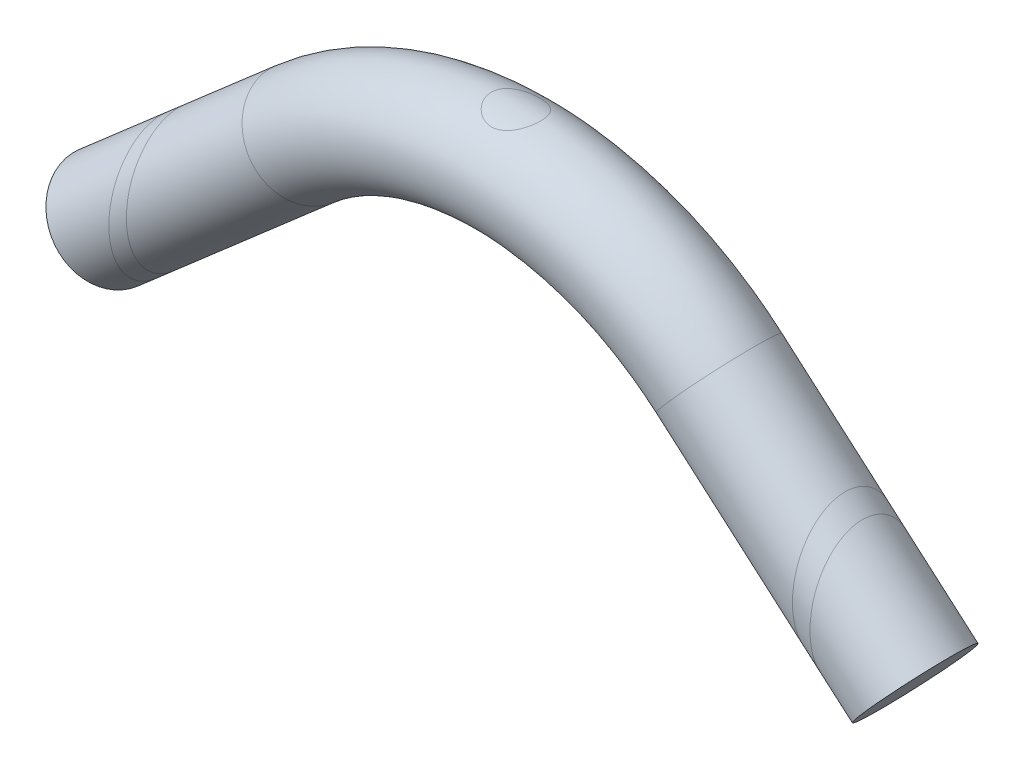
ISO-10303-21;
HEADER;
FILE_DESCRIPTION(('STEP AP214'),'2;1');
FILE_NAME('part.step','',(''),(''),'','','');
FILE_SCHEMA(('AUTOMOTIVE_DESIGN { 1 0 10303 214 1 1 1 1 }'));
ENDSEC;
DATA;
#1=APPLICATION_CONTEXT('core data for automotive mechanical design processes');
#2=APPLICATION_PROTOCOL_DEFINITION('international standard','automotive_design',2000,#1);
#3=PRODUCT_CONTEXT('',#1,'mechanical');
#4=PRODUCT('Part','Part','',(#3));
#5=PRODUCT_RELATED_PRODUCT_CATEGORY('part','',(#4));
#6=PRODUCT_DEFINITION_FORMATION('','',#4);
#7=PRODUCT_DEFINITION_CONTEXT('part definition',#1,'design');
#8=PRODUCT_DEFINITION('design','',#6,#7);
#9=PRODUCT_DEFINITION_SHAPE('','',#8);
#10=(LENGTH_UNIT() NAMED_UNIT(*) SI_UNIT(.MILLI.,.METRE.));
#11=(NAMED_UNIT(*) PLANE_ANGLE_UNIT() SI_UNIT($,.RADIAN.));
#12=(NAMED_UNIT(*) SI_UNIT($,.STERADIAN.) SOLID_ANGLE_UNIT());
#13=UNCERTAINTY_MEASURE_WITH_UNIT(LENGTH_MEASURE(1.E-05),#10,'distance_accuracy_value','');
#14=(GEOMETRIC_REPRESENTATION_CONTEXT(3) GLOBAL_UNCERTAINTY_ASSIGNED_CONTEXT((#13)) GLOBAL_UNIT_ASSIGNED_CONTEXT((#10,
#11,#12)) REPRESENTATION_CONTEXT('',''));
#15=CARTESIAN_POINT('',(0.,0.,0.));
#16=DIRECTION('',(0.,0.,1.));
#17=DIRECTION('',(1.,0.,0.));
#18=AXIS2_PLACEMENT_3D('',#15,#16,#17);
#19=CARTESIAN_POINT('',(55.9439156567688,48.6468831797989,0.));
#20=DIRECTION('',(-0.754605522163505,-0.656178714924787,0.));
#21=DIRECTION('',(0.656178714924787,-0.754605522163505,0.));
#22=AXIS2_PLACEMENT_3D('',#19,#20,#21);
#23=CYLINDRICAL_SURFACE('',#22,15.);
#24=CARTESIAN_POINT('',(55.9439156567688,48.6468831797989,0.));
#25=DIRECTION('',(0.7546055221635,0.656178714924792,0.));
#26=DIRECTION('',(0.,0.,-1.));
#27=AXIS2_PLACEMENT_3D('',#24,#25,#26);
#28=CIRCLE('',#27,15.);
#29=CARTESIAN_POINT('',(55.9439156567688,48.6468831797989,-15.));
#30=VERTEX_POINT('',#29);
#31=EDGE_CURVE('E122',#30,#30,#28,.T.);
#32=ORIENTED_EDGE('',*,*,#31,.F.);
#33=EDGE_LOOP('',(#32));
#34=FACE_BOUND('',#33,.T.);
#35=CARTESIAN_POINT('',(20.,17.3913043478261,0.));
#36=DIRECTION('',(1.,0.,0.));
#37=DIRECTION('',(0.,-1.,0.));
#38=AXIS2_PLACEMENT_3D('',#35,#36,#37);
#39=ELLIPSE('',#38,19.8779356358194,15.);
#40=CARTESIAN_POINT('',(20.,-2.48663128799326,0.));
#41=VERTEX_POINT('',#40);
#42=EDGE_CURVE('E11',#41,#41,#39,.T.);
#43=ORIENTED_EDGE('',*,*,#42,.T.);
#44=EDGE_LOOP('',(#43));
#45=FACE_BOUND('',#44,.T.);
#46=ADVANCED_FACE('F40',(#34,#45),#23,.T.);
#47=CARTESIAN_POINT('',(174.056084343231,48.6468831797989,0.));
#48=DIRECTION('',(0.754605522163505,-0.656178714924787,0.));
#49=DIRECTION('',(0.656178714924787,0.754605522163505,0.));
#50=AXIS2_PLACEMENT_3D('',#47,#48,#49);
#51=CYLINDRICAL_SURFACE('',#50,15.);
#52=CARTESIAN_POINT('',(174.056084343231,48.6468831797989,0.));
#53=DIRECTION('',(0.754605522163501,-0.656178714924791,0.));
#54=DIRECTION('',(0.,0.,-1.));
#55=AXIS2_PLACEMENT_3D('',#52,#53,#54);
#56=CIRCLE('',#55,15.);
#57=CARTESIAN_POINT('',(174.056084343231,48.6468831797989,-15.));
#58=VERTEX_POINT('',#57);
#59=EDGE_CURVE('E128',#58,#58,#56,.T.);
#60=ORIENTED_EDGE('',*,*,#59,.T.);
#61=EDGE_LOOP('',(#60));
#62=FACE_BOUND('',#61,.T.);
#63=CARTESIAN_POINT('',(210.,17.3913043478261,0.));
#64=DIRECTION('',(-1.,0.,0.));
#65=DIRECTION('',(0.,-1.,0.));
#66=AXIS2_PLACEMENT_3D('',#63,#64,#65);
#67=ELLIPSE('',#66,19.8779356358194,15.);
#68=CARTESIAN_POINT('',(210.,-2.48663128799325,0.));
#69=VERTEX_POINT('',#68);
#70=EDGE_CURVE('E47',#69,#69,#67,.T.);
#71=ORIENTED_EDGE('',*,*,#70,.T.);
#72=EDGE_LOOP('',(#71));
#73=FACE_BOUND('',#72,.T.);
#74=ADVANCED_FACE('F95',(#62,#73),#51,.T.);
#75=ORIENTED_EDGE('',*,*,#70,.F.);
#76=EDGE_LOOP('',(#75));
#77=FACE_BOUND('',#76,.T.);
#78=CARTESIAN_POINT('',(215.,13.0434782608696,0.));
#79=DIRECTION('',(-1.,0.,0.));
#80=DIRECTION('',(0.,-1.,0.));
#81=AXIS2_PLACEMENT_3D('',#78,#79,#80);
#82=ELLIPSE('',#81,19.8779356358194,15.);
#83=CARTESIAN_POINT('',(215.,-6.83445737494978,0.));
#84=VERTEX_POINT('',#83);
#85=EDGE_CURVE('E51',#84,#84,#82,.T.);
#86=ORIENTED_EDGE('',*,*,#85,.T.);
#87=EDGE_LOOP('',(#86));
#88=FACE_BOUND('',#87,.T.);
#89=ADVANCED_FACE('F96',(#77,#88),#51,.T.);
#90=ORIENTED_EDGE('',*,*,#42,.F.);
#91=EDGE_LOOP('',(#90));
#92=FACE_BOUND('',#91,.T.);
#93=CARTESIAN_POINT('',(15.,13.0434782608696,0.));
#94=DIRECTION('',(1.,0.,0.));
#95=DIRECTION('',(0.,-1.,0.));
#96=AXIS2_PLACEMENT_3D('',#93,#94,#95);
#97=ELLIPSE('',#96,19.8779356358194,15.);
#98=CARTESIAN_POINT('',(15.,-6.83445737494979,0.));
#99=VERTEX_POINT('',#98);
#100=EDGE_CURVE('E55',#99,#99,#97,.T.);
#101=ORIENTED_EDGE('',*,*,#100,.T.);
#102=EDGE_LOOP('',(#101));
#103=FACE_BOUND('',#102,.T.);
#104=ADVANCED_FACE('F86',(#92,#103),#23,.T.);
#105=CARTESIAN_POINT('',(115.,-19.2676138149161,0.));
#106=DIRECTION('',(0.,0.,-1.));
#107=DIRECTION('',(-1.,0.,0.));
#108=AXIS2_PLACEMENT_3D('',#105,#106,#107);
#109=TOROIDAL_SURFACE('',#108,90.,15.);
#110=CARTESIAN_POINT('',(110.588080153037,85.0106860922542,-4.2962066277505));
#111=CARTESIAN_POINT('',(110.710333370802,84.9688042737843,-4.4534690690307));
#112=CARTESIAN_POINT('',(110.839197371035,84.9257780592193,-4.60537547301822));
#113=CARTESIAN_POINT('',(111.1092662584,84.8385685155191,-4.89755901823602));
#114=CARTESIAN_POINT('',(111.250478951075,84.7943844670604,-5.03782869320342));
#115=CARTESIAN_POINT('',(111.544722648569,84.7059378756666,-5.30620513999618));
#116=CARTESIAN_POINT('',(111.697783390272,84.6616754268374,-5.43427938207064));
#117=CARTESIAN_POINT('',(112.014505516151,84.5744150263256,-5.67705037735854));
#118=CARTESIAN_POINT('',(112.1781667711,84.5314170592374,-5.7917472936023));
#119=CARTESIAN_POINT('',(112.515366098727,84.4478828490656,-6.00711752303018));
#120=CARTESIAN_POINT('',(112.688915873195,84.4073496450391,-6.10777371412001));
#121=CARTESIAN_POINT('',(113.044595434889,84.3300760783223,-6.29406440857466));
#122=CARTESIAN_POINT('',(113.226720619008,84.2933337138385,-6.37970685698598));
#123=CARTESIAN_POINT('',(113.598324847087,84.2248607838035,-6.53519724918478));
#124=CARTESIAN_POINT('',(113.787797448337,84.1931259458068,-6.60505867961943));
#125=CARTESIAN_POINT('',(114.172914955624,84.1357511855118,-6.72834766548335));
#126=CARTESIAN_POINT('',(114.36855940978,84.1101108181647,-6.78177642099294));
#127=CARTESIAN_POINT('',(114.755652334536,84.0668680557006,-6.8695575852939));
#128=CARTESIAN_POINT('',(114.946897046943,84.0489574207315,-6.90465638501284));
#129=CARTESIAN_POINT('',(115.332170430975,84.020196550908,-6.95885151039911));
#130=CARTESIAN_POINT('',(115.526199023221,84.0093461151455,-6.97794829143142));
#131=CARTESIAN_POINT('',(115.915391274496,83.9950818814304,-6.99987763591605));
#132=CARTESIAN_POINT('',(116.110554591912,83.9916659508422,-7.00271486390702));
#133=CARTESIAN_POINT('',(116.500417542304,83.9923464117247,-6.99207973530268));
#134=CARTESIAN_POINT('',(116.695117197268,83.9964424395744,-6.97860816815513));
#135=CARTESIAN_POINT('',(117.067728790116,84.0113360326328,-6.93714730416917));
#136=CARTESIAN_POINT('',(117.245794709894,84.0216021716241,-6.91033566265612));
#137=CARTESIAN_POINT('',(117.598975783804,84.0479765892532,-6.84317181756936));
#138=CARTESIAN_POINT('',(117.774089902676,84.0640868747138,-6.80281496305834));
#139=CARTESIAN_POINT('',(118.120129153532,84.1015870161339,-6.70895336512736));
#140=CARTESIAN_POINT('',(118.291055192349,84.1229757178679,-6.65545149612454));
#141=CARTESIAN_POINT('',(118.627805073403,84.1703534045374,-6.53573510631109));
#142=CARTESIAN_POINT('',(118.793626917288,84.1963441650056,-6.46951567806704));
#143=CARTESIAN_POINT('',(119.123873754301,84.2529417584928,-6.3228119698531));
#144=CARTESIAN_POINT('',(119.28812184553,84.2836597292608,-6.24197261588938));
#145=CARTESIAN_POINT('',(119.609366823573,84.3482341430492,-6.06795742131536));
#146=CARTESIAN_POINT('',(119.766361229131,84.3820916482703,-5.97477740088003));
#147=CARTESIAN_POINT('',(120.072280573781,84.4520067227481,-5.7766867816381));
#148=CARTESIAN_POINT('',(120.221204277575,84.4880646270118,-5.67177439456514));
#149=CARTESIAN_POINT('',(120.510238709914,84.5614402896209,-5.4508349929985));
#150=CARTESIAN_POINT('',(120.65034900969,84.5987581091255,-5.33480743844589));
#151=CARTESIAN_POINT('',(120.9322498906,84.6768284482927,-5.08223563876463));
#152=CARTESIAN_POINT('',(121.073224772209,84.7176102477644,-4.94478843472622));
#153=CARTESIAN_POINT('',(121.343156686449,84.798425291416,-4.65844140575154));
#154=CARTESIAN_POINT('',(121.472117314919,84.8384587566846,-4.50954503203698));
#155=CARTESIAN_POINT('',(121.71730888673,84.9167306671187,-4.20103378765223));
#156=CARTESIAN_POINT('',(121.833533091867,84.9549681560692,-4.04141331474065));
#157=CARTESIAN_POINT('',(122.052303357531,85.0285885811069,-3.71252862345495));
#158=CARTESIAN_POINT('',(122.154855044328,85.0639726889834,-3.54326841303101));
#159=CARTESIAN_POINT('',(122.346717327223,85.1313755875043,-3.19392038639429));
#160=CARTESIAN_POINT('',(122.435847230271,85.1633470099221,-3.01372402498222));
#161=CARTESIAN_POINT('',(122.598482421903,85.2225141655747,-2.64573895426173));
#162=CARTESIAN_POINT('',(122.671994054538,85.2497118370958,-2.45795336468779));
#163=CARTESIAN_POINT('',(122.802698746245,85.2985764546699,-2.07611951544548));
#164=CARTESIAN_POINT('',(122.859894848006,85.320244431878,-1.88207243100892));
#165=CARTESIAN_POINT('',(122.957367681183,85.3574319659421,-1.48919977748589));
#166=CARTESIAN_POINT('',(122.997645533564,85.3729519301478,-1.29037452591319));
#167=CARTESIAN_POINT('',(123.058913869096,85.3966527345453,-0.901706109966652));
#168=CARTESIAN_POINT('',(123.080923122626,85.4052205239438,-0.712046559922282));
#169=CARTESIAN_POINT('',(123.109372290643,85.4163072653736,-0.331389929648165));
#170=CARTESIAN_POINT('',(123.115812867672,85.4188264748088,-0.140392906682985));
#171=CARTESIAN_POINT('',(123.113056349095,85.4177499653922,0.241433878820464));
#172=CARTESIAN_POINT('',(123.10386215487,85.4141553810918,0.432263665818315));
#173=CARTESIAN_POINT('',(123.069940492403,85.4009480141408,0.81232491651545));
#174=CARTESIAN_POINT('',(123.045213214133,85.391335305093,1.00155639973363));
#175=CARTESIAN_POINT('',(122.981706914586,85.3668148227675,1.36992080717891));
#176=CARTESIAN_POINT('',(122.943492144028,85.3521200920466,1.54916566283535));
#177=CARTESIAN_POINT('',(122.853261599904,85.3177364835023,1.90371771504092));
#178=CARTESIAN_POINT('',(122.801241289798,85.2980459641415,2.07902359665502));
#179=CARTESIAN_POINT('',(122.683878514959,85.2541417479619,2.42447362828106));
#180=CARTESIAN_POINT('',(122.618539718023,85.2299292965981,2.59461918461446));
#181=CARTESIAN_POINT('',(122.475036647971,85.1775264790299,2.92884814521632));
#182=CARTESIAN_POINT('',(122.396867503848,85.1493346026189,3.09292921802148));
#183=CARTESIAN_POINT('',(122.225485014265,85.0886207978344,3.41941645051938));
#184=CARTESIAN_POINT('',(122.131856266044,85.0559856633698,3.58158346009102));
#185=CARTESIAN_POINT('',(121.932185885003,84.9879273628851,3.89754163667667));
#186=CARTESIAN_POINT('',(121.826139987575,84.9525032403774,4.05132989932328));
#187=CARTESIAN_POINT('',(121.602331203223,84.8797145505011,4.34968686838114));
#188=CARTESIAN_POINT('',(121.484566014176,84.8423496025711,4.49425375416813));
#189=CARTESIAN_POINT('',(121.238034147643,84.7665831011805,4.77339229034065));
#190=CARTESIAN_POINT('',(121.109267040012,84.7281815072299,4.90796354953866));
#191=CARTESIAN_POINT('',(120.83296549764,84.6488510823205,5.17458545109663));
#192=CARTESIAN_POINT('',(120.68475926227,84.6079159453474,5.30593902725085));
#193=CARTESIAN_POINT('',(120.377627606019,84.5271266400189,5.55570944600869));
#194=CARTESIAN_POINT('',(120.218705653631,84.4872721276848,5.67413044246271));
#195=CARTESIAN_POINT('',(119.89091851249,84.4098115802084,5.89736247324602));
#196=CARTESIAN_POINT('',(119.722048040828,84.3722067614634,6.00216618003143));
#197=CARTESIAN_POINT('',(119.375507637768,84.3004965381697,6.19726639330381));
#198=CARTESIAN_POINT('',(119.197841599385,84.2663896055912,6.28756924423712));
#199=CARTESIAN_POINT('',(118.834269568391,84.2027551109962,6.45317700387719));
#200=CARTESIAN_POINT('',(118.648343103257,84.1732398484052,6.5284417791101));
#201=CARTESIAN_POINT('',(118.270045462923,84.1200229119304,6.6629125089341));
#202=CARTESIAN_POINT('',(118.077677190635,84.0963186584229,6.72212559043436));
#203=CARTESIAN_POINT('',(117.687969778928,84.0556852747822,6.82386208781551));
#204=CARTESIAN_POINT('',(117.490633156485,84.0387527846583,6.86639378040877));
#205=CARTESIAN_POINT('',(117.092538078232,84.01239764525,6.93429383785227));
#206=CARTESIAN_POINT('',(116.891779933409,84.0029743171255,6.95966375412261));
#207=CARTESIAN_POINT('',(116.504768948846,83.9925301845096,6.99159556826833));
#208=CARTESIAN_POINT('',(116.318642233454,83.990896824193,6.99950115884557));
#209=CARTESIAN_POINT('',(115.94641886261,83.9944771481832,7.00045299850533));
#210=CARTESIAN_POINT('',(115.760322206343,83.9996905959763,6.99349976086059));
#211=CARTESIAN_POINT('',(115.389592400176,84.0168226221296,6.96483359219984));
#212=CARTESIAN_POINT('',(115.204959200379,84.0287409708789,6.94312116661015));
#213=CARTESIAN_POINT('',(114.838509730042,84.0589036105019,6.88519875181672));
#214=CARTESIAN_POINT('',(114.656693478643,84.0771479443441,6.84898866413869));
#215=CARTESIAN_POINT('',(114.3028996378,84.1187028280134,6.76385396128808));
#216=CARTESIAN_POINT('',(114.130793423706,84.1418324635609,6.7153735630145));
#217=CARTESIAN_POINT('',(113.791370715898,84.1928110794241,6.60563055134465));
#218=CARTESIAN_POINT('',(113.624055802481,84.2206615963224,6.54436377465014));
#219=CARTESIAN_POINT('',(113.295192422658,84.2803103376349,6.40955658898653));
#220=CARTESIAN_POINT('',(113.133643359528,84.3121081519977,6.3360174546161));
#221=CARTESIAN_POINT('',(112.817077814765,84.3788300563019,6.17718672134496));
#222=CARTESIAN_POINT('',(112.66206372923,84.4137552785163,6.09189085986355));
#223=CARTESIAN_POINT('',(112.185889551197,84.527199870655,5.80590071543633));
#224=CARTESIAN_POINT('',(111.877636388994,84.6098627364902,5.58486502024433));
#225=CARTESIAN_POINT('',(111.300992664287,84.7771921779112,5.09626568169539));
#226=CARTESIAN_POINT('',(111.032618901987,84.8618595806439,4.82868253150557));
#227=CARTESIAN_POINT('',(110.656758959061,84.9868457062657,4.38774965636404));
#228=CARTESIAN_POINT('',(110.532732668831,85.0293850870082,4.22886253040263));
#229=CARTESIAN_POINT('',(110.298553181085,85.1116147768516,3.90051516276549));
#230=CARTESIAN_POINT('',(110.188394688551,85.1513061708697,3.73105899375852));
#231=CARTESIAN_POINT('',(109.982792722496,85.2267917595245,3.38255586542018));
#232=CARTESIAN_POINT('',(109.887353326724,85.2625848733857,3.20350626679009));
#233=CARTESIAN_POINT('',(109.712122653994,85.3292764202803,2.83712420281949));
#234=CARTESIAN_POINT('',(109.632323913399,85.3601771865553,2.64979574066493));
#235=CARTESIAN_POINT('',(109.491432438313,85.4153422487658,2.27427805383052));
#236=CARTESIAN_POINT('',(109.429820553541,85.4397880476273,2.08631035208692));
#237=CARTESIAN_POINT('',(109.322620925367,85.4826476401047,1.70526817229623));
#238=CARTESIAN_POINT('',(109.277026147471,85.5010640814895,1.51219597623475));
#239=CARTESIAN_POINT('',(109.202346170299,85.531371267952,1.12244027245747));
#240=CARTESIAN_POINT('',(109.173255718276,85.5432640892284,0.925757934319541));
#241=CARTESIAN_POINT('',(109.131906519475,85.5602014132011,0.53034304298823));
#242=CARTESIAN_POINT('',(109.119646770423,85.5652463236921,0.331610612588547));
#243=CARTESIAN_POINT('',(109.112361814033,85.5682422788509,-0.0525573048315527));
#244=CARTESIAN_POINT('',(109.116211079731,85.5666566049037,-0.237968898069775));
#245=CARTESIAN_POINT('',(109.138590540779,85.5574650745516,-0.607752204338709));
#246=CARTESIAN_POINT('',(109.157120438002,85.5498593403987,-0.792123938409721));
#247=CARTESIAN_POINT('',(109.208680654315,85.5288071406463,-1.15857657709778));
#248=CARTESIAN_POINT('',(109.241717935168,85.5153578709,-1.3406563386441));
#249=CARTESIAN_POINT('',(109.321961668142,85.4829410774606,-1.70115684484258));
#250=CARTESIAN_POINT('',(109.369167841579,85.4639736623023,-1.87957766138766));
#251=CARTESIAN_POINT('',(109.476837752284,85.4211512839357,-2.23007003319368));
#252=CARTESIAN_POINT('',(109.537184642564,85.397339512107,-2.40218284193045));
#253=CARTESIAN_POINT('',(109.670873923034,85.345256981579,-2.74067575201019));
#254=CARTESIAN_POINT('',(109.744222242161,85.3169841892056,-2.9070531963787));
#255=CARTESIAN_POINT('',(109.903134541232,85.2566806089604,-3.23268376002478));
#256=CARTESIAN_POINT('',(109.988671643189,85.2246581166929,-3.3919515682039));
#257=CARTESIAN_POINT('',(110.171469688416,85.157496779529,-3.70290615147262));
#258=CARTESIAN_POINT('',(110.268728505616,85.1223585000749,-3.85459429431335));
#259=CARTESIAN_POINT('',(110.406347255765,85.0737364254853,-4.05208266311589));
#260=CARTESIAN_POINT('',(110.441822844075,85.0612916986711,-4.10159895159401));
#261=CARTESIAN_POINT('',(110.514020189777,85.0361622485383,-4.1996455192194));
#262=CARTESIAN_POINT('',(110.550741844408,85.0234775450483,-4.248175879149));
#263=CARTESIAN_POINT('',(110.588080153037,85.0106860922542,-4.2962066277505));
#264=B_SPLINE_CURVE_WITH_KNOTS('',3,(#110,#111,#112,#113,#114,#115,#116,#117,#118,#119,#120,
#121,#122,#123,#124,#125,#126,#127,#128,#129,#130,#131,#132,#133,#134,#135,#136,#137,#138,#139,
#140,#141,#142,#143,#144,#145,#146,#147,#148,#149,#150,#151,#152,#153,#154,#155,#156,#157,#158,
#159,#160,#161,#162,#163,#164,#165,#166,#167,#168,#169,#170,#171,#172,#173,#174,#175,#176,#177,
#178,#179,#180,#181,#182,#183,#184,#185,#186,#187,#188,#189,#190,#191,#192,#193,#194,#195,#196,
#197,#198,#199,#200,#201,#202,#203,#204,#205,#206,#207,#208,#209,#210,#211,#212,#213,#214,#215,
#216,#217,#218,#219,#220,#221,#222,#223,#224,#225,#226,#227,#228,#229,#230,#231,#232,#233,#234,
#235,#236,#237,#238,#239,#240,#241,#242,#243,#244,#245,#246,#247,#248,#249,#250,#251,#252,#253,
#254,#255,#256,#257,#258,#259,#260,#261,#262,#263),.UNSPECIFIED.,.T.,.F.,(4,2,2,2,2,2,2,2,2,2,2,
2,2,2,2,2,2,2,2,2,2,2,2,2,2,2,2,2,2,2,2,2,2,2,2,2,2,2,2,2,2,2,2,2,2,2,2,2,2,2,2,2,2,2,2,2,2,2,2,
2,2,2,2,2,2,2,2,2,2,2,2,2,2,2,2,2,4),(0.,0.610583154258999,1.22155508387627,1.83411354908098,
2.44666454821633,3.05995611756356,3.67292215608763,4.28536234774131,4.89775780218489,
5.4827606047,6.06774675938806,6.65256508491316,7.23735510270296,7.77782479478306,
8.31848025482477,8.85901759492557,9.39976393741608,9.9560409169922,10.5125067936111,
11.0690576035641,11.6256354686938,12.2281490998513,12.8304818168144,13.433131674907,
14.0355327707213,14.6454316891759,15.2550823945687,15.8646193315388,16.4741158755875,
17.0467669865314,17.6193937272455,18.1919142158294,18.7644277025078,19.3153806197387,
19.8665148063945,20.4174974199651,20.9686896985028,21.5382990279597,22.1081045639122,
22.678022253517,23.2479622356057,23.8539298161883,24.4597021883869,25.0657991920599,
25.6716302880339,26.2790572361728,26.8862140449935,27.49306922193,28.0998695319825,
28.6580674392732,29.216246064887,29.7744055767147,30.3325688798632,30.8728608248962,
31.4133289664783,31.9537410103037,32.4943495066914,33.6537163615298,34.8135702526524,
35.4309340716962,36.0480614485684,36.6653594871847,37.2823622334899,37.879517706626,
38.4764105883977,39.0731133934439,39.6697806631347,40.2254808277781,40.7811697078659,
41.3371255422854,41.8930704425,42.4442602774599,42.9957021167478,43.5459462444301,
44.0960907192746,44.2825890249726,44.4690719877435),.UNSPECIFIED.);
#265=CARTESIAN_POINT('',(110.588080153037,85.0106860922542,-4.2962066277505));
#266=VERTEX_POINT('',#265);
#267=EDGE_CURVE('E61',#266,#266,#264,.T.);
#268=ORIENTED_EDGE('',*,*,#267,.T.);
#269=EDGE_LOOP('',(#268));
#270=FACE_BOUND('',#269,.T.);
#271=ORIENTED_EDGE('',*,*,#31,.T.);
#272=EDGE_LOOP('',(#271));
#273=FACE_BOUND('',#272,.T.);
#274=ORIENTED_EDGE('',*,*,#59,.F.);
#275=EDGE_LOOP('',(#274));
#276=FACE_BOUND('',#275,.T.);
#277=CARTESIAN_POINT('',(109.933391254338,55.9260523832273,-3.28518633884096));
#278=CARTESIAN_POINT('',(109.850554926002,55.885405402096,-3.12933368514236));
#279=CARTESIAN_POINT('',(109.773418214975,55.8468356871537,-2.96996870099587));
#280=CARTESIAN_POINT('',(109.631107156614,55.7747094830647,-2.64490910331585));
#281=CARTESIAN_POINT('',(109.565928902859,55.7411513574717,-2.47921657821852));
#282=CARTESIAN_POINT('',(109.448105513525,55.6798497887927,-2.14230960341092));
#283=CARTESIAN_POINT('',(109.395465288062,55.6521086242396,-1.97109302008707));
#284=CARTESIAN_POINT('',(109.30331881756,55.6031764525475,-1.62431099541703));
#285=CARTESIAN_POINT('',(109.26380711382,55.5819827233118,-1.44874739422411));
#286=CARTESIAN_POINT('',(109.19823362242,55.5466375365953,-1.09376995621378));
#287=CARTESIAN_POINT('',(109.172219974742,55.5325112911819,-0.914344683553706));
#288=CARTESIAN_POINT('',(109.134183667741,55.5118103120392,-0.553578792316565));
#289=CARTESIAN_POINT('',(109.122161095748,55.5052356254452,-0.372238161791371));
#290=CARTESIAN_POINT('',(109.112266917108,55.4998269696694,-0.0090883409304081));
#291=CARTESIAN_POINT('',(109.114392727907,55.5009915878048,0.172720757838162));
#292=CARTESIAN_POINT('',(109.132761240932,55.5110249627403,0.535405302012874));
#293=CARTESIAN_POINT('',(109.149003552284,55.5198935062252,0.716280773130885));
#294=CARTESIAN_POINT('',(109.194351999909,55.5445161565612,1.06766132226524));
#295=CARTESIAN_POINT('',(109.222850207741,55.5599445108563,1.23826836408292));
#296=CARTESIAN_POINT('',(109.292221302295,55.5972131994188,1.57629228208433));
#297=CARTESIAN_POINT('',(109.333098528034,55.6190557818796,1.74370801776504));
#298=CARTESIAN_POINT('',(109.42678661095,55.6686122825542,2.07422933291182));
#299=CARTESIAN_POINT('',(109.479595019406,55.6963249959263,2.23733578914069));
#300=CARTESIAN_POINT('',(109.596671972321,55.7569884247127,2.55843976175653));
#301=CARTESIAN_POINT('',(109.660945005777,55.7899411913306,2.71643524820182));
#302=CARTESIAN_POINT('',(109.803620201269,55.8619713090125,3.03363393056508));
#303=CARTESIAN_POINT('',(109.882536653307,55.9012607953367,3.19255779146102));
#304=CARTESIAN_POINT('',(110.051700006,55.9838618087907,3.50319043985705));
#305=CARTESIAN_POINT('',(110.141950753704,56.0271747002257,3.65489675338061));
#306=CARTESIAN_POINT('',(110.428795725838,56.1617269021387,4.09820480372602));
#307=CARTESIAN_POINT('',(110.64154113551,56.2576102479595,4.37812457475948));
#308=CARTESIAN_POINT('',(111.132614892154,56.4651011084693,4.93278331210469));
#309=CARTESIAN_POINT('',(111.415692452066,56.5772406818364,5.20313606118373));
#310=CARTESIAN_POINT('',(111.871962982569,56.7405613396114,5.5711918797224));
#311=CARTESIAN_POINT('',(112.029453625249,56.794223630953,5.68770192899172));
#312=CARTESIAN_POINT('',(112.354438310901,56.8984238727423,5.90758204454914));
#313=CARTESIAN_POINT('',(112.521933809658,56.9489613663194,6.01095019170785));
#314=CARTESIAN_POINT('',(112.872765134174,57.0472016072538,6.20744543682728));
#315=CARTESIAN_POINT('',(113.056463404467,57.094718298911,6.30001960434356));
#316=CARTESIAN_POINT('',(113.432595008502,57.1829107833407,6.46909885026798));
#317=CARTESIAN_POINT('',(113.625023697788,57.2235901605098,6.54561235359402));
#318=CARTESIAN_POINT('',(114.017158909609,57.2964360908466,6.68159298468269));
#319=CARTESIAN_POINT('',(114.216857429527,57.3286117007114,6.74107825354513));
#320=CARTESIAN_POINT('',(114.622039304866,57.3830352709583,6.84220611840026));
#321=CARTESIAN_POINT('',(114.827521555294,57.4052851141753,6.88385209829713));
#322=CARTESIAN_POINT('',(115.217354273426,57.4367328354587,6.94471296377342));
#323=CARTESIAN_POINT('',(115.401279904485,57.4471770181733,6.96602063091498));
#324=CARTESIAN_POINT('',(115.770527922844,57.4590600727176,6.99398833156427));
#325=CARTESIAN_POINT('',(115.955850188481,57.460499720072,7.00064962647377));
#326=CARTESIAN_POINT('',(116.326238840949,57.4542531481262,6.99925059921114));
#327=CARTESIAN_POINT('',(116.51130527646,57.4465690080589,6.99119363097977));
#328=CARTESIAN_POINT('',(116.87963072235,57.4223125797845,6.96052483273872));
#329=CARTESIAN_POINT('',(117.062889778305,57.4057405162938,6.93791337071249));
#330=CARTESIAN_POINT('',(117.40965439089,57.3661480958896,6.88119790964346));
#331=CARTESIAN_POINT('',(117.573445024415,57.3438482182855,6.84832112421899));
#332=CARTESIAN_POINT('',(117.897363384952,57.2929767158562,6.77123078919048));
#333=CARTESIAN_POINT('',(118.057489883964,57.2644030214518,6.72701349781942));
#334=CARTESIAN_POINT('',(118.530994857264,57.1703626694853,6.5780281926156));
#335=CARTESIAN_POINT('',(118.837722535086,57.09654962527,6.45688942380725));
#336=CARTESIAN_POINT('',(119.453484947097,56.9264219260193,6.16267158573632));
#337=CARTESIAN_POINT('',(119.760383871534,56.8287055144302,5.98598162919719));
#338=CARTESIAN_POINT('',(120.342251891883,56.6241435787289,5.59026743280804));
#339=CARTESIAN_POINT('',(120.617198539697,56.5172917268931,5.37121371468464));
#340=CARTESIAN_POINT('',(121.167239162233,56.2882922273435,4.86110788289713));
#341=CARTESIAN_POINT('',(121.43702584735,56.1660858830036,4.56427808080865));
#342=CARTESIAN_POINT('',(121.801980342056,55.9919702789259,4.08586020586252));
#343=CARTESIAN_POINT('',(121.917064358628,55.9354349059724,3.92075668106545));
#344=CARTESIAN_POINT('',(122.13321618802,55.8268803090733,3.58010025112732));
#345=CARTESIAN_POINT('',(122.234282544038,55.7748615547321,3.40454626261528));
#346=CARTESIAN_POINT('',(122.421895924091,55.6765783148253,3.04301517466002));
#347=CARTESIAN_POINT('',(122.508361124457,55.6303466102296,2.85698665186399));
#348=CARTESIAN_POINT('',(122.665069104737,55.5454021615802,2.47665936449795));
#349=CARTESIAN_POINT('',(122.735320574381,55.5066853916834,2.28236509638579));
#350=CARTESIAN_POINT('',(122.858640280988,55.4380433076997,1.88705594256089));
#351=CARTESIAN_POINT('',(122.911722904177,55.4081106351473,1.68604684003719));
#352=CARTESIAN_POINT('',(122.999939992876,55.3580485298426,1.27893799404978));
#353=CARTESIAN_POINT('',(123.035077441398,55.337917467803,1.07283910263248));
#354=CARTESIAN_POINT('',(123.083559449586,55.3100574165093,0.6836250629273));
#355=CARTESIAN_POINT('',(123.099083380232,55.3010902899938,0.500866668580504));
#356=CARTESIAN_POINT('',(123.115726245529,55.2914748283552,0.134483551658487));
#357=CARTESIAN_POINT('',(123.116846513387,55.2908257233135,-0.0491410891627479));
#358=CARTESIAN_POINT('',(123.104667771456,55.2978648883821,-0.415711481983137));
#359=CARTESIAN_POINT('',(123.091371530919,55.3055515572819,-0.598657357593258));
#360=CARTESIAN_POINT('',(123.050555450501,55.329033282948,-0.962422240880587));
#361=CARTESIAN_POINT('',(123.02303577438,55.3448282463599,-1.1432412730206));
#362=CARTESIAN_POINT('',(122.956437622442,55.3827706767016,-1.48944929056385));
#363=CARTESIAN_POINT('',(122.918249851723,55.4044256606709,-1.65506455105893));
#364=CARTESIAN_POINT('',(122.830226858101,55.4538864994621,-1.98225207137916));
#365=CARTESIAN_POINT('',(122.780387711522,55.4816944261584,-2.14382294889529));
#366=CARTESIAN_POINT('',(122.614127547524,55.5734192797068,-2.62099858332312));
#367=CARTESIAN_POINT('',(122.480912754841,55.6456673729504,-2.92932741235546));
#368=CARTESIAN_POINT('',(122.16266660692,55.8123722420983,-3.54250955652881));
#369=CARTESIAN_POINT('',(121.974502494707,55.90808679013,-3.84537433507285));
#370=CARTESIAN_POINT('',(121.556607650105,56.1100774462298,-4.41704614376227));
#371=CARTESIAN_POINT('',(121.326848961755,56.2163606357573,-4.68583006009616));
#372=CARTESIAN_POINT('',(120.798507260962,56.4445796243657,-5.21713390179304));
#373=CARTESIAN_POINT('',(120.494899909488,56.5668001748412,-5.47459651661765));
#374=CARTESIAN_POINT('',(120.008454041581,56.7424748965096,-5.82045871173079));
#375=CARTESIAN_POINT('',(119.841013179374,56.7997921198351,-5.92908201304899));
#376=CARTESIAN_POINT('',(119.496356476464,56.9102842175264,-6.13219508328189));
#377=CARTESIAN_POINT('',(119.319139388101,56.9634585610718,-6.22668304248023));
#378=CARTESIAN_POINT('',(118.952475130866,57.064925459351,-6.40223813799449));
#379=CARTESIAN_POINT('',(118.762861161382,57.1131080452517,-6.48302105405458));
#380=CARTESIAN_POINT('',(118.375727676036,57.2016966608196,-6.62797561002581));
#381=CARTESIAN_POINT('',(118.178212656977,57.242107039984,-6.69215654774554));
#382=CARTESIAN_POINT('',(117.77690577097,57.3135602503606,-6.80294567859223));
#383=CARTESIAN_POINT('',(117.573121790693,57.3446143605783,-6.84957504723146));
#384=CARTESIAN_POINT('',(117.160904345527,57.3961027948979,-6.9245316590524));
#385=CARTESIAN_POINT('',(116.952471831291,57.4165392699745,-6.95286260950414));
#386=CARTESIAN_POINT('',(116.561845560042,57.4438989940701,-6.98806225899943));
#387=CARTESIAN_POINT('',(116.379967406503,57.4522895323224,-6.99733876296101));
#388=CARTESIAN_POINT('',(116.01585647301,57.4602593432555,-7.00167005053253));
#389=CARTESIAN_POINT('',(115.833623730097,57.4598394915904,-6.99672624752428));
#390=CARTESIAN_POINT('',(115.470348595596,57.4502660965152,-6.97266497515801));
#391=CARTESIAN_POINT('',(115.289306113148,57.4411132277279,-6.95354860065233));
#392=CARTESIAN_POINT('',(114.929866608705,57.4144750371725,-6.90140193361878));
#393=CARTESIAN_POINT('',(114.751469576131,57.3969897487358,-6.86837169674943));
#394=CARTESIAN_POINT('',(114.411640642494,57.3559320326195,-6.79175506002751));
#395=CARTESIAN_POINT('',(114.249926300815,57.332902170955,-6.74912422432795));
#396=CARTESIAN_POINT('',(113.93079648891,57.2809746753626,-6.65272483869331));
#397=CARTESIAN_POINT('',(113.77338247632,57.2520750791556,-6.59895256400287));
#398=CARTESIAN_POINT('',(113.308815261268,57.1577552359955,-6.4216209738825));
#399=CARTESIAN_POINT('',(113.009179568954,57.084693666089,-6.28201092957208));
#400=CARTESIAN_POINT('',(112.405896631726,56.9171793623188,-5.94780617660471));
#401=CARTESIAN_POINT('',(112.104980421529,56.821302289469,-5.74904499726975));
#402=CARTESIAN_POINT('',(111.538416910951,56.6230240025249,-5.30913801368193));
#403=CARTESIAN_POINT('',(111.272766657692,56.520623335726,-5.06799576200192));
#404=CARTESIAN_POINT('',(110.81267729311,56.3314986881857,-4.58113048321395));
#405=CARTESIAN_POINT('',(110.613472825172,56.2444556876619,-4.34000639245879));
#406=CARTESIAN_POINT('',(110.247901594051,56.0780784940398,-3.83139325801679));
#407=CARTESIAN_POINT('',(110.08153211521,55.9987436637032,-3.56390639744275));
#408=CARTESIAN_POINT('',(109.933391254338,55.9260523832273,-3.28518633884096));
#409=B_SPLINE_CURVE_WITH_KNOTS('',3,(#277,#278,#279,#280,#281,#282,#283,#284,#285,#286,#287,
#288,#289,#290,#291,#292,#293,#294,#295,#296,#297,#298,#299,#300,#301,#302,#303,#304,#305,#306,
#307,#308,#309,#310,#311,#312,#313,#314,#315,#316,#317,#318,#319,#320,#321,#322,#323,#324,#325,
#326,#327,#328,#329,#330,#331,#332,#333,#334,#335,#336,#337,#338,#339,#340,#341,#342,#343,#344,
#345,#346,#347,#348,#349,#350,#351,#352,#353,#354,#355,#356,#357,#358,#359,#360,#361,#362,#363,
#364,#365,#366,#367,#368,#369,#370,#371,#372,#373,#374,#375,#376,#377,#378,#379,#380,#381,#382,
#383,#384,#385,#386,#387,#388,#389,#390,#391,#392,#393,#394,#395,#396,#397,#398,#399,#400,#401,
#402,#403,#404,#405,#406,#407,#408),.UNSPECIFIED.,.T.,.F.,(4,2,2,2,2,2,2,2,2,2,2,2,2,2,2,2,2,2,
2,2,2,2,2,2,2,2,2,2,2,2,2,2,2,2,2,2,2,2,2,2,2,2,2,2,2,2,2,2,2,2,2,2,2,2,2,2,2,2,2,2,2,2,2,2,2,
4),(0.,0.543124865260171,1.08607199306228,1.62923140033289,2.17216468419189,2.7170212226301,
3.26188116192831,3.80664164874186,4.35138705207688,4.87176476164114,5.39232508226518,
5.91277866146226,6.43343647448725,6.97806685003175,7.52288258434156,8.61208418065553,
9.82792244238956,10.4367184912157,11.045603341468,11.6781116966883,12.3102874241903,
12.9417871326304,13.5731669998688,14.1287430781859,14.6842713062849,15.2396729585555,
15.7950605690746,16.3001162847317,16.8053388569201,17.8151062950591,18.913017665634,
20.0116957703631,21.2633135386563,21.8898263782065,22.5164042801188,23.1463846510256,
23.7760265965397,24.4051395734663,25.0341479394224,25.5843230008326,26.1344471374947,
26.6844656200733,27.2344777701782,27.7479016072992,28.2614985929476,29.2878984956678,
30.3911445954324,31.4951349650268,32.7382405666514,33.3606085361359,33.9830561179399,
34.6171511556078,35.2508903006575,35.8838623863416,36.5167061912572,37.0628864184232,
37.6090123616326,38.1550961201917,38.7011776943159,39.2070780394377,39.7131477885562,
40.7248046157683,41.8400535100971,42.9552089637769,43.9265900537336,44.8978907706669),.UNSPECIFIED.);
#410=CARTESIAN_POINT('',(109.933391254338,55.9260523832273,-3.28518633884096));
#411=VERTEX_POINT('',#410);
#412=EDGE_CURVE('E60',#411,#411,#409,.T.);
#413=ORIENTED_EDGE('',*,*,#412,.T.);
#414=EDGE_LOOP('',(#413));
#415=FACE_BOUND('',#414,.T.);
#416=ADVANCED_FACE('F81',(#270,#273,#276,#415),#109,.T.);
#417=ORIENTED_EDGE('',*,*,#412,.F.);
#418=EDGE_LOOP('',(#417));
#419=FACE_BOUND('',#418,.T.);
#420=ADVANCED_FACE('F80',(#419),#109,.T.);
#421=ORIENTED_EDGE('',*,*,#100,.F.);
#422=EDGE_LOOP('',(#421));
#423=FACE_BOUND('',#422,.T.);
#424=CARTESIAN_POINT('',(0.,0.,0.));
#425=DIRECTION('',(0.7546055221635,0.656178714924792,0.));
#426=DIRECTION('',(0.,0.,-1.));
#427=AXIS2_PLACEMENT_3D('',#424,#425,#426);
#428=CIRCLE('',#427,15.);
#429=CARTESIAN_POINT('',(0.,0.,-15.));
#430=VERTEX_POINT('',#429);
#431=EDGE_CURVE('E68',#430,#430,#428,.T.);
#432=ORIENTED_EDGE('',*,*,#431,.T.);
#433=EDGE_LOOP('',(#432));
#434=FACE_BOUND('',#433,.T.);
#435=ADVANCED_FACE('F78',(#423,#434),#23,.T.);
#436=ORIENTED_EDGE('',*,*,#267,.F.);
#437=EDGE_LOOP('',(#436));
#438=FACE_BOUND('',#437,.T.);
#439=ADVANCED_FACE('F73',(#438),#109,.T.);
#440=CARTESIAN_POINT('',(0.,0.,0.));
#441=DIRECTION('',(0.7546055221635,0.656178714924792,0.));
#442=DIRECTION('',(0.,0.,-1.));
#443=AXIS2_PLACEMENT_3D('',#440,#441,#442);
#444=PLANE('',#443);
#445=ORIENTED_EDGE('',*,*,#431,.F.);
#446=EDGE_LOOP('',(#445));
#447=FACE_BOUND('',#446,.T.);
#448=ADVANCED_FACE('F77',(#447),#444,.F.);
#449=ORIENTED_EDGE('',*,*,#85,.F.);
#450=EDGE_LOOP('',(#449));
#451=FACE_BOUND('',#450,.T.);
#452=CARTESIAN_POINT('',(230.,0.,0.));
#453=DIRECTION('',(0.754605522163501,-0.656178714924791,0.));
#454=DIRECTION('',(0.,0.,-1.));
#455=AXIS2_PLACEMENT_3D('',#452,#453,#454);
#456=CIRCLE('',#455,15.);
#457=CARTESIAN_POINT('',(230.,0.,-15.));
#458=VERTEX_POINT('',#457);
#459=EDGE_CURVE('E124',#458,#458,#456,.T.);
#460=ORIENTED_EDGE('',*,*,#459,.F.);
#461=EDGE_LOOP('',(#460));
#462=FACE_BOUND('',#461,.T.);
#463=ADVANCED_FACE('F89',(#451,#462),#51,.T.);
#464=CARTESIAN_POINT('',(230.,0.,0.));
#465=DIRECTION('',(-0.754605522163501,0.656178714924791,0.));
#466=DIRECTION('',(0.,0.,-1.));
#467=AXIS2_PLACEMENT_3D('',#464,#465,#466);
#468=PLANE('',#467);
#469=ORIENTED_EDGE('',*,*,#459,.T.);
#470=EDGE_LOOP('',(#469));
#471=FACE_BOUND('',#470,.T.);
#472=ADVANCED_FACE('F93',(#471),#468,.F.);
#473=CLOSED_SHELL('',(#46,#74,#89,#104,#416,#420,#435,#439,#448,#463,#472));
#474=MANIFOLD_SOLID_BREP('B2',#473);
#475=ADVANCED_BREP_SHAPE_REPRESENTATION('',(#18,#474),#14);
#476=SHAPE_DEFINITION_REPRESENTATION(#9,#475);
ENDSEC;
END-ISO-10303-21;
